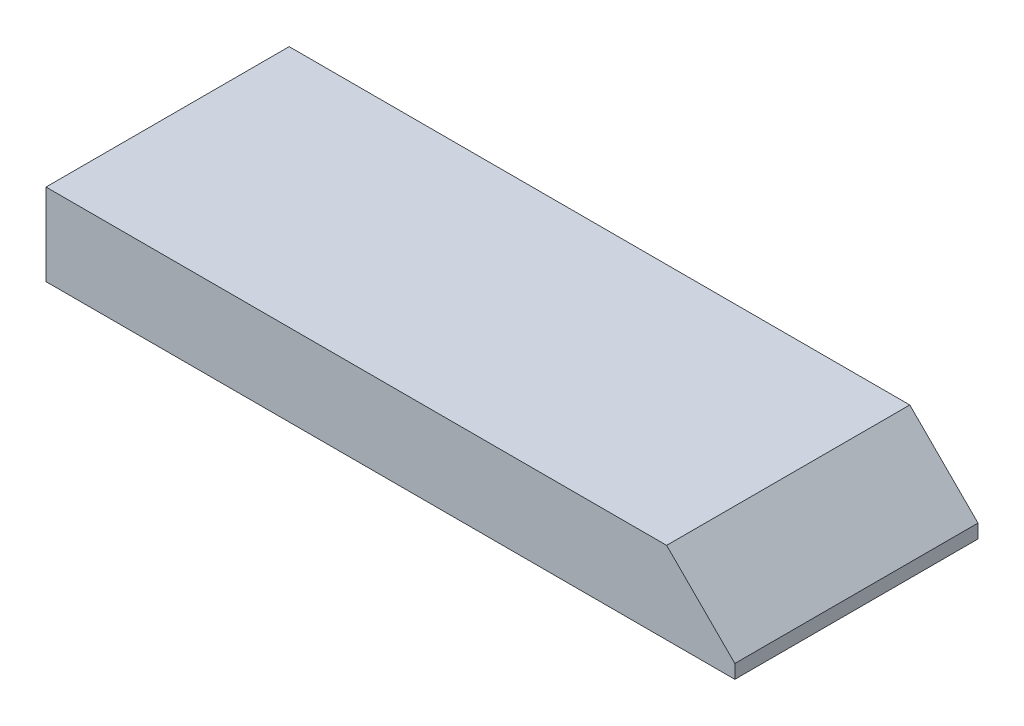
ISO-10303-21;
HEADER;
FILE_DESCRIPTION(('STEP AP214'),'2;1');
FILE_NAME('part.step','',(''),(''),'','','');
FILE_SCHEMA(('AUTOMOTIVE_DESIGN { 1 0 10303 214 1 1 1 1 }'));
ENDSEC;
DATA;
#1=APPLICATION_CONTEXT('core data for automotive mechanical design processes');
#2=APPLICATION_PROTOCOL_DEFINITION('international standard','automotive_design',2000,#1);
#3=PRODUCT_CONTEXT('',#1,'mechanical');
#4=PRODUCT('Part','Part','',(#3));
#5=PRODUCT_RELATED_PRODUCT_CATEGORY('part','',(#4));
#6=PRODUCT_DEFINITION_FORMATION('','',#4);
#7=PRODUCT_DEFINITION_CONTEXT('part definition',#1,'design');
#8=PRODUCT_DEFINITION('design','',#6,#7);
#9=PRODUCT_DEFINITION_SHAPE('','',#8);
#10=(LENGTH_UNIT() NAMED_UNIT(*) SI_UNIT(.MILLI.,.METRE.));
#11=(NAMED_UNIT(*) PLANE_ANGLE_UNIT() SI_UNIT($,.RADIAN.));
#12=(NAMED_UNIT(*) SI_UNIT($,.STERADIAN.) SOLID_ANGLE_UNIT());
#13=UNCERTAINTY_MEASURE_WITH_UNIT(LENGTH_MEASURE(1.E-05),#10,'distance_accuracy_value','');
#14=(GEOMETRIC_REPRESENTATION_CONTEXT(3) GLOBAL_UNCERTAINTY_ASSIGNED_CONTEXT((#13)) GLOBAL_UNIT_ASSIGNED_CONTEXT((#10,
#11,#12)) REPRESENTATION_CONTEXT('',''));
#15=CARTESIAN_POINT('',(0.,0.,0.));
#16=DIRECTION('',(0.,0.,1.));
#17=DIRECTION('',(1.,0.,0.));
#18=AXIS2_PLACEMENT_3D('',#15,#16,#17);
#19=CARTESIAN_POINT('',(0.,0.,35.3));
#20=DIRECTION('',(1.,0.,0.));
#21=DIRECTION('',(0.,1.,0.));
#22=AXIS2_PLACEMENT_3D('',#19,#20,#21);
#23=PLANE('',#22);
#24=DIRECTION('',(0.,-1.,0.));
#25=VECTOR('',#24,1.);
#26=CARTESIAN_POINT('',(0.,0.,0.));
#27=LINE('',#26,#25);
#28=CARTESIAN_POINT('',(0.,0.,0.));
#29=VERTEX_POINT('',#28);
#30=CARTESIAN_POINT('',(0.,-11.8994949366117,0.));
#31=VERTEX_POINT('',#30);
#32=EDGE_CURVE('E116',#29,#31,#27,.T.);
#33=ORIENTED_EDGE('',*,*,#32,.T.);
#34=DIRECTION('',(0.,0.,-1.));
#35=VECTOR('',#34,1.);
#36=CARTESIAN_POINT('',(0.,-11.8994949366117,35.3));
#37=LINE('',#36,#35);
#38=CARTESIAN_POINT('',(0.,-11.8994949366117,35.3));
#39=VERTEX_POINT('',#38);
#40=EDGE_CURVE('E11',#39,#31,#37,.T.);
#41=ORIENTED_EDGE('',*,*,#40,.F.);
#42=DIRECTION('',(0.,-1.,0.));
#43=VECTOR('',#42,1.);
#44=CARTESIAN_POINT('',(0.,0.,35.3));
#45=LINE('',#44,#43);
#46=CARTESIAN_POINT('',(0.,0.,35.3));
#47=VERTEX_POINT('',#46);
#48=EDGE_CURVE('E124',#47,#39,#45,.T.);
#49=ORIENTED_EDGE('',*,*,#48,.F.);
#50=DIRECTION('',(0.,0.,-1.));
#51=VECTOR('',#50,1.);
#52=CARTESIAN_POINT('',(0.,0.,35.3));
#53=LINE('',#52,#51);
#54=EDGE_CURVE('E112',#47,#29,#53,.T.);
#55=ORIENTED_EDGE('',*,*,#54,.T.);
#56=EDGE_LOOP('',(#33,#41,#49,#55));
#57=FACE_BOUND('',#56,.T.);
#58=ADVANCED_FACE('F42',(#57),#23,.F.);
#59=CARTESIAN_POINT('',(0.,-11.8994949366117,35.3));
#60=DIRECTION('',(0.,1.,0.));
#61=DIRECTION('',(0.,0.,1.));
#62=AXIS2_PLACEMENT_3D('',#59,#60,#61);
#63=PLANE('',#62);
#64=DIRECTION('',(1.,0.,0.));
#65=VECTOR('',#64,1.);
#66=CARTESIAN_POINT('',(0.,-11.8994949366117,0.));
#67=LINE('',#66,#65);
#68=CARTESIAN_POINT('',(100.,-11.8994949366117,0.));
#69=VERTEX_POINT('',#68);
#70=EDGE_CURVE('E119',#31,#69,#67,.T.);
#71=ORIENTED_EDGE('',*,*,#70,.T.);
#72=DIRECTION('',(0.,0.,-1.));
#73=VECTOR('',#72,1.);
#74=CARTESIAN_POINT('',(100.,-11.8994949366117,35.3));
#75=LINE('',#74,#73);
#76=CARTESIAN_POINT('',(100.,-11.8994949366117,35.3));
#77=VERTEX_POINT('',#76);
#78=EDGE_CURVE('E50',#77,#69,#75,.T.);
#79=ORIENTED_EDGE('',*,*,#78,.F.);
#80=DIRECTION('',(1.,0.,0.));
#81=VECTOR('',#80,1.);
#82=CARTESIAN_POINT('',(0.,-11.8994949366117,35.3));
#83=LINE('',#82,#81);
#84=EDGE_CURVE('E92',#39,#77,#83,.T.);
#85=ORIENTED_EDGE('',*,*,#84,.F.);
#86=ORIENTED_EDGE('',*,*,#40,.T.);
#87=EDGE_LOOP('',(#71,#79,#85,#86));
#88=FACE_BOUND('',#87,.T.);
#89=ADVANCED_FACE('F143',(#88),#63,.F.);
#90=CARTESIAN_POINT('',(100.,-9.89949493661172,35.3));
#91=DIRECTION('',(-1.,0.,0.));
#92=DIRECTION('',(0.,-1.,0.));
#93=AXIS2_PLACEMENT_3D('',#90,#91,#92);
#94=PLANE('',#93);
#95=DIRECTION('',(0.,1.,0.));
#96=VECTOR('',#95,1.);
#97=CARTESIAN_POINT('',(100.,-9.89949493661172,0.));
#98=LINE('',#97,#96);
#99=CARTESIAN_POINT('',(100.,-9.89949493661172,0.));
#100=VERTEX_POINT('',#99);
#101=EDGE_CURVE('E107',#69,#100,#98,.T.);
#102=ORIENTED_EDGE('',*,*,#101,.T.);
#103=DIRECTION('',(0.,0.,-1.));
#104=VECTOR('',#103,1.);
#105=CARTESIAN_POINT('',(100.,-9.89949493661172,35.3));
#106=LINE('',#105,#104);
#107=CARTESIAN_POINT('',(100.,-9.89949493661172,35.3));
#108=VERTEX_POINT('',#107);
#109=EDGE_CURVE('E104',#108,#100,#106,.T.);
#110=ORIENTED_EDGE('',*,*,#109,.F.);
#111=DIRECTION('',(0.,1.,0.));
#112=VECTOR('',#111,1.);
#113=CARTESIAN_POINT('',(100.,-9.89949493661172,35.3));
#114=LINE('',#113,#112);
#115=EDGE_CURVE('E96',#77,#108,#114,.T.);
#116=ORIENTED_EDGE('',*,*,#115,.F.);
#117=ORIENTED_EDGE('',*,*,#78,.T.);
#118=EDGE_LOOP('',(#102,#110,#116,#117));
#119=FACE_BOUND('',#118,.T.);
#120=ADVANCED_FACE('F105',(#119),#94,.F.);
#121=CARTESIAN_POINT('',(100.,-9.89949493661172,35.3));
#122=DIRECTION('',(-0.707106781186551,-0.707106781186544,0.));
#123=DIRECTION('',(0.707106781186544,-0.707106781186551,0.));
#124=AXIS2_PLACEMENT_3D('',#121,#122,#123);
#125=PLANE('',#124);
#126=DIRECTION('',(-0.707106781186544,0.707106781186551,0.));
#127=VECTOR('',#126,1.);
#128=CARTESIAN_POINT('',(100.,-9.89949493661172,0.));
#129=LINE('',#128,#127);
#130=CARTESIAN_POINT('',(90.1005050633884,0.,0.));
#131=VERTEX_POINT('',#130);
#132=EDGE_CURVE('E78',#100,#131,#129,.T.);
#133=ORIENTED_EDGE('',*,*,#132,.T.);
#134=DIRECTION('',(0.,0.,-1.));
#135=VECTOR('',#134,1.);
#136=CARTESIAN_POINT('',(90.1005050633884,0.,35.3));
#137=LINE('',#136,#135);
#138=CARTESIAN_POINT('',(90.1005050633884,0.,35.3));
#139=VERTEX_POINT('',#138);
#140=EDGE_CURVE('E108',#139,#131,#137,.T.);
#141=ORIENTED_EDGE('',*,*,#140,.F.);
#142=DIRECTION('',(-0.707106781186544,0.707106781186551,0.));
#143=VECTOR('',#142,1.);
#144=CARTESIAN_POINT('',(100.,-9.89949493661172,35.3));
#145=LINE('',#144,#143);
#146=EDGE_CURVE('E100',#108,#139,#145,.T.);
#147=ORIENTED_EDGE('',*,*,#146,.F.);
#148=ORIENTED_EDGE('',*,*,#109,.T.);
#149=EDGE_LOOP('',(#133,#141,#147,#148));
#150=FACE_BOUND('',#149,.T.);
#151=ADVANCED_FACE('F110',(#150),#125,.F.);
#152=CARTESIAN_POINT('',(0.,0.,35.3));
#153=DIRECTION('',(0.,-1.,0.));
#154=DIRECTION('',(0.,0.,-1.));
#155=AXIS2_PLACEMENT_3D('',#152,#153,#154);
#156=PLANE('',#155);
#157=DIRECTION('',(-1.,0.,0.));
#158=VECTOR('',#157,1.);
#159=CARTESIAN_POINT('',(0.,0.,0.));
#160=LINE('',#159,#158);
#161=EDGE_CURVE('E84',#131,#29,#160,.T.);
#162=ORIENTED_EDGE('',*,*,#161,.T.);
#163=ORIENTED_EDGE('',*,*,#54,.F.);
#164=DIRECTION('',(-1.,0.,0.));
#165=VECTOR('',#164,1.);
#166=CARTESIAN_POINT('',(0.,0.,35.3));
#167=LINE('',#166,#165);
#168=EDGE_CURVE('E58',#139,#47,#167,.T.);
#169=ORIENTED_EDGE('',*,*,#168,.F.);
#170=ORIENTED_EDGE('',*,*,#140,.T.);
#171=EDGE_LOOP('',(#162,#163,#169,#170));
#172=FACE_BOUND('',#171,.T.);
#173=ADVANCED_FACE('F132',(#172),#156,.F.);
#174=CARTESIAN_POINT('',(0.,0.,35.3));
#175=DIRECTION('',(0.,0.,1.));
#176=DIRECTION('',(1.,0.,0.));
#177=AXIS2_PLACEMENT_3D('',#174,#175,#176);
#178=PLANE('',#177);
#179=ORIENTED_EDGE('',*,*,#48,.T.);
#180=ORIENTED_EDGE('',*,*,#84,.T.);
#181=ORIENTED_EDGE('',*,*,#115,.T.);
#182=ORIENTED_EDGE('',*,*,#146,.T.);
#183=ORIENTED_EDGE('',*,*,#168,.T.);
#184=EDGE_LOOP('',(#179,#180,#181,#182,#183));
#185=FACE_BOUND('',#184,.T.);
#186=ADVANCED_FACE('F98',(#185),#178,.T.);
#187=CARTESIAN_POINT('',(0.,0.,0.));
#188=DIRECTION('',(0.,0.,1.));
#189=DIRECTION('',(1.,0.,0.));
#190=AXIS2_PLACEMENT_3D('',#187,#188,#189);
#191=PLANE('',#190);
#192=ORIENTED_EDGE('',*,*,#32,.F.);
#193=ORIENTED_EDGE('',*,*,#161,.F.);
#194=ORIENTED_EDGE('',*,*,#132,.F.);
#195=ORIENTED_EDGE('',*,*,#101,.F.);
#196=ORIENTED_EDGE('',*,*,#70,.F.);
#197=EDGE_LOOP('',(#192,#193,#194,#195,#196));
#198=FACE_BOUND('',#197,.T.);
#199=ADVANCED_FACE('F128',(#198),#191,.F.);
#200=CLOSED_SHELL('',(#58,#89,#120,#151,#173,#186,#199));
#201=MANIFOLD_SOLID_BREP('B2',#200);
#202=ADVANCED_BREP_SHAPE_REPRESENTATION('',(#18,#201),#14);
#203=SHAPE_DEFINITION_REPRESENTATION(#9,#202);
ENDSEC;
END-ISO-10303-21;
